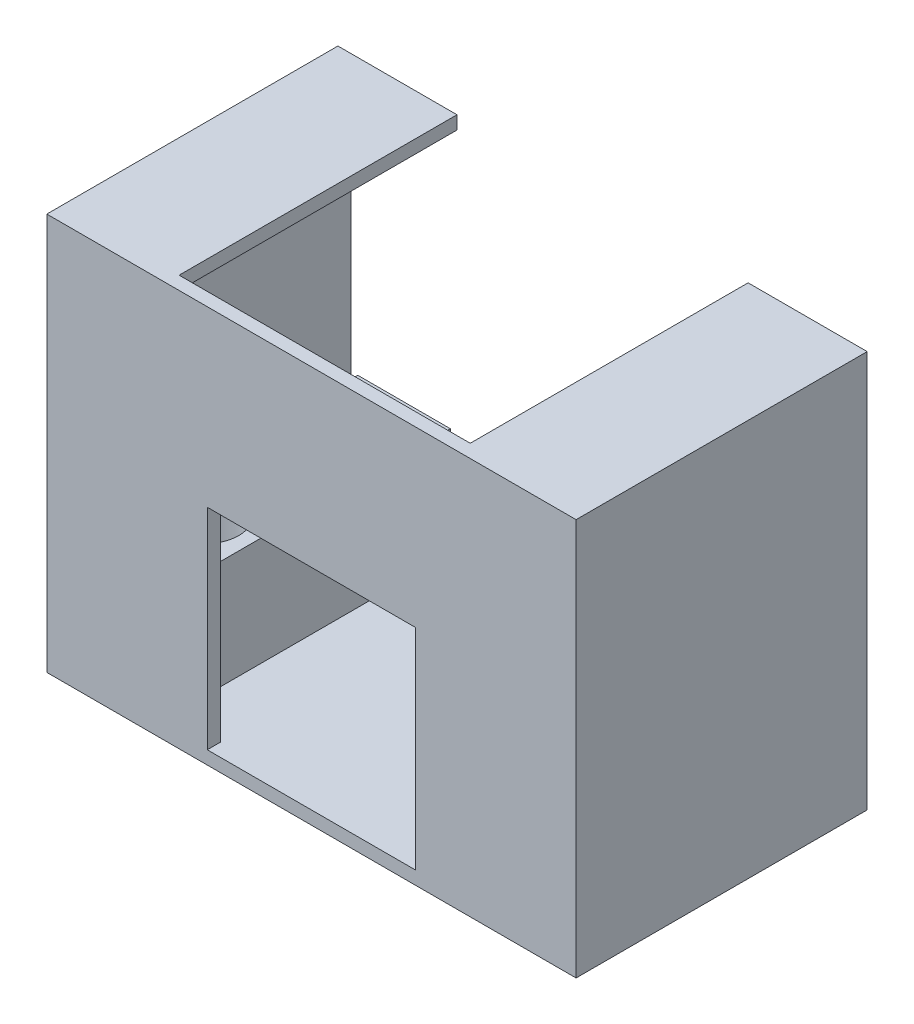
ISO-10303-21;
HEADER;
FILE_DESCRIPTION(('STEP AP214'),'2;1');
FILE_NAME('part.step','',(''),(''),'','','');
FILE_SCHEMA(('AUTOMOTIVE_DESIGN { 1 0 10303 214 1 1 1 1 }'));
ENDSEC;
DATA;
#1=APPLICATION_CONTEXT('core data for automotive mechanical design processes');
#2=APPLICATION_PROTOCOL_DEFINITION('international standard','automotive_design',2000,#1);
#3=PRODUCT_CONTEXT('',#1,'mechanical');
#4=PRODUCT('Part','Part','',(#3));
#5=PRODUCT_RELATED_PRODUCT_CATEGORY('part','',(#4));
#6=PRODUCT_DEFINITION_FORMATION('','',#4);
#7=PRODUCT_DEFINITION_CONTEXT('part definition',#1,'design');
#8=PRODUCT_DEFINITION('design','',#6,#7);
#9=PRODUCT_DEFINITION_SHAPE('','',#8);
#10=(LENGTH_UNIT() NAMED_UNIT(*) SI_UNIT(.MILLI.,.METRE.));
#11=(NAMED_UNIT(*) PLANE_ANGLE_UNIT() SI_UNIT($,.RADIAN.));
#12=(NAMED_UNIT(*) SI_UNIT($,.STERADIAN.) SOLID_ANGLE_UNIT());
#13=UNCERTAINTY_MEASURE_WITH_UNIT(LENGTH_MEASURE(1.E-05),#10,'distance_accuracy_value','');
#14=(GEOMETRIC_REPRESENTATION_CONTEXT(3) GLOBAL_UNCERTAINTY_ASSIGNED_CONTEXT((#13)) GLOBAL_UNIT_ASSIGNED_CONTEXT((#10,
#11,#12)) REPRESENTATION_CONTEXT('',''));
#15=CARTESIAN_POINT('',(0.,0.,0.));
#16=DIRECTION('',(0.,0.,1.));
#17=DIRECTION('',(1.,0.,0.));
#18=AXIS2_PLACEMENT_3D('',#15,#16,#17);
#19=CARTESIAN_POINT('',(0.,0.,-6.));
#20=DIRECTION('',(0.,0.,-1.));
#21=DIRECTION('',(-1.,0.,0.));
#22=AXIS2_PLACEMENT_3D('',#19,#20,#21);
#23=PLANE('',#22);
#24=DIRECTION('',(1.,0.,0.));
#25=VECTOR('',#24,1.);
#26=CARTESIAN_POINT('',(0.,19.7449997738004,-6.));
#27=LINE('',#26,#25);
#28=CARTESIAN_POINT('',(11.,19.7449997738004,-6.));
#29=VERTEX_POINT('',#28);
#30=CARTESIAN_POINT('',(19.,19.7449997738004,-6.));
#31=VERTEX_POINT('',#30);
#32=EDGE_CURVE('E215',#29,#31,#27,.T.);
#33=ORIENTED_EDGE('',*,*,#32,.F.);
#34=DIRECTION('',(0.,1.,0.));
#35=VECTOR('',#34,1.);
#36=CARTESIAN_POINT('',(11.,19.7449997738004,-6.));
#37=LINE('',#36,#35);
#38=CARTESIAN_POINT('',(11.,20.7449997738004,-6.));
#39=VERTEX_POINT('',#38);
#40=EDGE_CURVE('E198',#29,#39,#37,.T.);
#41=ORIENTED_EDGE('',*,*,#40,.T.);
#42=DIRECTION('',(1.,0.,0.));
#43=VECTOR('',#42,1.);
#44=CARTESIAN_POINT('',(0.,20.7449997738004,-6.));
#45=LINE('',#44,#43);
#46=CARTESIAN_POINT('',(20.,20.7449997738004,-6.));
#47=VERTEX_POINT('',#46);
#48=EDGE_CURVE('E243',#39,#47,#45,.T.);
#49=ORIENTED_EDGE('',*,*,#48,.T.);
#50=DIRECTION('',(0.,-1.,0.));
#51=VECTOR('',#50,1.);
#52=CARTESIAN_POINT('',(20.,0.,-6.));
#53=LINE('',#52,#51);
#54=CARTESIAN_POINT('',(20.,-9.25500022619963,-6.));
#55=VERTEX_POINT('',#54);
#56=EDGE_CURVE('E250',#47,#55,#53,.T.);
#57=ORIENTED_EDGE('',*,*,#56,.T.);
#58=DIRECTION('',(-1.,0.,0.));
#59=VECTOR('',#58,1.);
#60=CARTESIAN_POINT('',(0.,-9.25500022619963,-6.));
#61=LINE('',#60,#59);
#62=CARTESIAN_POINT('',(-20.,-9.25500022619963,-6.));
#63=VERTEX_POINT('',#62);
#64=EDGE_CURVE('E247',#55,#63,#61,.T.);
#65=ORIENTED_EDGE('',*,*,#64,.T.);
#66=DIRECTION('',(0.,1.,0.));
#67=VECTOR('',#66,1.);
#68=CARTESIAN_POINT('',(-20.,0.,-6.));
#69=LINE('',#68,#67);
#70=CARTESIAN_POINT('',(-20.,20.7449997738004,-6.));
#71=VERTEX_POINT('',#70);
#72=EDGE_CURVE('E244',#63,#71,#69,.T.);
#73=ORIENTED_EDGE('',*,*,#72,.T.);
#74=CARTESIAN_POINT('',(-11.,20.7449997738004,-6.));
#75=VERTEX_POINT('',#74);
#76=EDGE_CURVE('E240',#71,#75,#45,.T.);
#77=ORIENTED_EDGE('',*,*,#76,.T.);
#78=DIRECTION('',(0.,1.,0.));
#79=VECTOR('',#78,1.);
#80=CARTESIAN_POINT('',(-11.,19.7449997738004,-6.));
#81=LINE('',#80,#79);
#82=CARTESIAN_POINT('',(-11.,19.7449997738004,-6.));
#83=VERTEX_POINT('',#82);
#84=EDGE_CURVE('E208',#83,#75,#81,.T.);
#85=ORIENTED_EDGE('',*,*,#84,.F.);
#86=CARTESIAN_POINT('',(-19.,19.7449997738004,-6.));
#87=VERTEX_POINT('',#86);
#88=EDGE_CURVE('E224',#87,#83,#27,.T.);
#89=ORIENTED_EDGE('',*,*,#88,.F.);
#90=DIRECTION('',(0.,1.,0.));
#91=VECTOR('',#90,1.);
#92=CARTESIAN_POINT('',(-19.,0.,-6.));
#93=LINE('',#92,#91);
#94=CARTESIAN_POINT('',(-19.,-8.25500022619963,-6.));
#95=VERTEX_POINT('',#94);
#96=EDGE_CURVE('E225',#95,#87,#93,.T.);
#97=ORIENTED_EDGE('',*,*,#96,.F.);
#98=DIRECTION('',(-1.,0.,0.));
#99=VECTOR('',#98,1.);
#100=CARTESIAN_POINT('',(0.,-8.25500022619963,-6.));
#101=LINE('',#100,#99);
#102=CARTESIAN_POINT('',(-18.5000000000002,-8.25500022619963,-6.));
#103=VERTEX_POINT('',#102);
#104=EDGE_CURVE('E238',#103,#95,#101,.T.);
#105=ORIENTED_EDGE('',*,*,#104,.F.);
#106=DIRECTION('',(0.,1.,0.));
#107=VECTOR('',#106,1.);
#108=CARTESIAN_POINT('',(-18.5000000000002,0.,-6.));
#109=LINE('',#108,#107);
#110=CARTESIAN_POINT('',(-18.5000000000002,-0.0550002261996245,-6.));
#111=VERTEX_POINT('',#110);
#112=EDGE_CURVE('E435',#103,#111,#109,.T.);
#113=ORIENTED_EDGE('',*,*,#112,.T.);
#114=DIRECTION('',(1.,0.,0.));
#115=VECTOR('',#114,1.);
#116=CARTESIAN_POINT('',(0.,-0.0550002261996268,-6.));
#117=LINE('',#116,#115);
#118=CARTESIAN_POINT('',(-11.5000000000002,-0.0550002261996254,-6.));
#119=VERTEX_POINT('',#118);
#120=EDGE_CURVE('E438',#111,#119,#117,.T.);
#121=ORIENTED_EDGE('',*,*,#120,.T.);
#122=DIRECTION('',(0.,-1.,0.));
#123=VECTOR('',#122,1.);
#124=CARTESIAN_POINT('',(-11.5000000000002,0.,-6.));
#125=LINE('',#124,#123);
#126=CARTESIAN_POINT('',(-11.5000000000002,-8.25500022619963,-6.));
#127=VERTEX_POINT('',#126);
#128=EDGE_CURVE('E432',#119,#127,#125,.T.);
#129=ORIENTED_EDGE('',*,*,#128,.T.);
#130=CARTESIAN_POINT('',(11.4999999999998,-8.25500022619963,-6.));
#131=VERTEX_POINT('',#130);
#132=EDGE_CURVE('E237',#131,#127,#101,.T.);
#133=ORIENTED_EDGE('',*,*,#132,.F.);
#134=DIRECTION('',(0.,1.,0.));
#135=VECTOR('',#134,1.);
#136=CARTESIAN_POINT('',(11.4999999999998,0.,-6.));
#137=LINE('',#136,#135);
#138=CARTESIAN_POINT('',(11.4999999999998,-0.055000226199629,-6.));
#139=VERTEX_POINT('',#138);
#140=EDGE_CURVE('E414',#131,#139,#137,.T.);
#141=ORIENTED_EDGE('',*,*,#140,.T.);
#142=DIRECTION('',(1.,0.,0.));
#143=VECTOR('',#142,1.);
#144=CARTESIAN_POINT('',(0.,-0.0550002261996276,-6.));
#145=LINE('',#144,#143);
#146=CARTESIAN_POINT('',(18.4999999999998,-0.0550002261996299,-6.));
#147=VERTEX_POINT('',#146);
#148=EDGE_CURVE('E417',#139,#147,#145,.T.);
#149=ORIENTED_EDGE('',*,*,#148,.T.);
#150=DIRECTION('',(0.,-1.,0.));
#151=VECTOR('',#150,1.);
#152=CARTESIAN_POINT('',(18.4999999999998,0.,-6.));
#153=LINE('',#152,#151);
#154=CARTESIAN_POINT('',(18.4999999999998,-8.25500022619963,-6.));
#155=VERTEX_POINT('',#154);
#156=EDGE_CURVE('E411',#147,#155,#153,.T.);
#157=ORIENTED_EDGE('',*,*,#156,.T.);
#158=CARTESIAN_POINT('',(19.,-8.25500022619963,-6.));
#159=VERTEX_POINT('',#158);
#160=EDGE_CURVE('E230',#159,#155,#101,.T.);
#161=ORIENTED_EDGE('',*,*,#160,.F.);
#162=DIRECTION('',(0.,-1.,0.));
#163=VECTOR('',#162,1.);
#164=CARTESIAN_POINT('',(19.,0.,-6.));
#165=LINE('',#164,#163);
#166=EDGE_CURVE('E222',#31,#159,#165,.T.);
#167=ORIENTED_EDGE('',*,*,#166,.F.);
#168=EDGE_LOOP('',(#33,#41,#49,#57,#65,#73,#77,#85,#89,#97,#105,#113,#121,#129,#133,#141,#149,
#157,#161,#167));
#169=FACE_BOUND('',#168,.T.);
#170=ADVANCED_FACE('F36',(#169),#23,.T.);
#171=CARTESIAN_POINT('',(0.,20.7449997738004,16.));
#172=DIRECTION('',(0.,-1.,0.));
#173=DIRECTION('',(0.,0.,-1.));
#174=AXIS2_PLACEMENT_3D('',#171,#172,#173);
#175=PLANE('',#174);
#176=DIRECTION('',(0.,0.,1.));
#177=VECTOR('',#176,1.);
#178=CARTESIAN_POINT('',(11.,20.7449997738004,0.));
#179=LINE('',#178,#177);
#180=CARTESIAN_POINT('',(11.,20.7449997738004,15.));
#181=VERTEX_POINT('',#180);
#182=EDGE_CURVE('E204',#39,#181,#179,.T.);
#183=ORIENTED_EDGE('',*,*,#182,.T.);
#184=DIRECTION('',(1.,0.,0.));
#185=VECTOR('',#184,1.);
#186=CARTESIAN_POINT('',(0.,20.7449997738004,15.));
#187=LINE('',#186,#185);
#188=CARTESIAN_POINT('',(-11.,20.7449997738004,15.));
#189=VERTEX_POINT('',#188);
#190=EDGE_CURVE('E219',#189,#181,#187,.T.);
#191=ORIENTED_EDGE('',*,*,#190,.F.);
#192=DIRECTION('',(0.,0.,1.));
#193=VECTOR('',#192,1.);
#194=CARTESIAN_POINT('',(-11.,20.7449997738004,0.));
#195=LINE('',#194,#193);
#196=EDGE_CURVE('E884',#75,#189,#195,.T.);
#197=ORIENTED_EDGE('',*,*,#196,.F.);
#198=ORIENTED_EDGE('',*,*,#76,.F.);
#199=DIRECTION('',(0.,0.,-1.));
#200=VECTOR('',#199,1.);
#201=CARTESIAN_POINT('',(-20.,20.7449997738004,16.));
#202=LINE('',#201,#200);
#203=CARTESIAN_POINT('',(-20.,20.7449997738004,16.));
#204=VERTEX_POINT('',#203);
#205=EDGE_CURVE('E228',#204,#71,#202,.T.);
#206=ORIENTED_EDGE('',*,*,#205,.F.);
#207=DIRECTION('',(-1.,0.,0.));
#208=VECTOR('',#207,1.);
#209=CARTESIAN_POINT('',(0.,20.7449997738004,16.));
#210=LINE('',#209,#208);
#211=CARTESIAN_POINT('',(20.,20.7449997738004,16.));
#212=VERTEX_POINT('',#211);
#213=EDGE_CURVE('E285',#212,#204,#210,.T.);
#214=ORIENTED_EDGE('',*,*,#213,.F.);
#215=DIRECTION('',(0.,0.,-1.));
#216=VECTOR('',#215,1.);
#217=CARTESIAN_POINT('',(20.,20.7449997738004,16.));
#218=LINE('',#217,#216);
#219=EDGE_CURVE('E259',#212,#47,#218,.T.);
#220=ORIENTED_EDGE('',*,*,#219,.T.);
#221=ORIENTED_EDGE('',*,*,#48,.F.);
#222=EDGE_LOOP('',(#183,#191,#197,#198,#206,#214,#220,#221));
#223=FACE_BOUND('',#222,.T.);
#224=ADVANCED_FACE('F484',(#223),#175,.F.);
#225=CARTESIAN_POINT('',(0.,19.7449997738004,16.));
#226=DIRECTION('',(0.,-1.,0.));
#227=DIRECTION('',(0.,0.,-1.));
#228=AXIS2_PLACEMENT_3D('',#225,#226,#227);
#229=PLANE('',#228);
#230=DIRECTION('',(-1.,0.,0.));
#231=VECTOR('',#230,1.);
#232=CARTESIAN_POINT('',(0.,19.7449997738004,15.));
#233=LINE('',#232,#231);
#234=CARTESIAN_POINT('',(19.,19.7449997738004,15.));
#235=VERTEX_POINT('',#234);
#236=CARTESIAN_POINT('',(11.,19.7449997738004,15.));
#237=VERTEX_POINT('',#236);
#238=EDGE_CURVE('E218',#235,#237,#233,.T.);
#239=ORIENTED_EDGE('',*,*,#238,.T.);
#240=DIRECTION('',(0.,0.,1.));
#241=VECTOR('',#240,1.);
#242=CARTESIAN_POINT('',(11.,19.7449997738004,0.));
#243=LINE('',#242,#241);
#244=EDGE_CURVE('E201',#29,#237,#243,.T.);
#245=ORIENTED_EDGE('',*,*,#244,.F.);
#246=ORIENTED_EDGE('',*,*,#32,.T.);
#247=DIRECTION('',(0.,0.,-1.));
#248=VECTOR('',#247,1.);
#249=CARTESIAN_POINT('',(19.,19.7449997738004,16.));
#250=LINE('',#249,#248);
#251=EDGE_CURVE('E40',#235,#31,#250,.T.);
#252=ORIENTED_EDGE('',*,*,#251,.F.);
#253=EDGE_LOOP('',(#239,#245,#246,#252));
#254=FACE_BOUND('',#253,.T.);
#255=ADVANCED_FACE('F213',(#254),#229,.T.);
#256=CARTESIAN_POINT('',(15.,-0.055000226199628,9.));
#257=DIRECTION('',(0.,-1.,0.));
#258=DIRECTION('',(0.,0.,-1.));
#259=AXIS2_PLACEMENT_3D('',#256,#257,#258);
#260=CYLINDRICAL_SURFACE('',#259,2.5);
#261=CARTESIAN_POINT('',(15.,-0.055000226199628,9.));
#262=DIRECTION('',(0.,-1.,0.));
#263=DIRECTION('',(0.,0.,-1.));
#264=AXIS2_PLACEMENT_3D('',#261,#262,#263);
#265=CIRCLE('',#264,2.5);
#266=CARTESIAN_POINT('',(15.,-0.055000226199628,6.5));
#267=VERTEX_POINT('',#266);
#268=EDGE_CURVE('E400',#267,#267,#265,.T.);
#269=ORIENTED_EDGE('',*,*,#268,.F.);
#270=EDGE_LOOP('',(#269));
#271=FACE_BOUND('',#270,.T.);
#272=CARTESIAN_POINT('',(15.,-8.45500022619963,9.));
#273=DIRECTION('',(0.,-1.,0.));
#274=DIRECTION('',(0.,0.,-1.));
#275=AXIS2_PLACEMENT_3D('',#272,#273,#274);
#276=CIRCLE('',#275,2.5);
#277=CARTESIAN_POINT('',(15.,-8.45500022619963,6.5));
#278=VERTEX_POINT('',#277);
#279=EDGE_CURVE('E370',#278,#278,#276,.T.);
#280=ORIENTED_EDGE('',*,*,#279,.T.);
#281=EDGE_LOOP('',(#280));
#282=FACE_BOUND('',#281,.T.);
#283=ADVANCED_FACE('F717',(#271,#282),#260,.F.);
#284=CARTESIAN_POINT('',(15.0000000000001,-0.055000226199628,-0.999999999999999));
#285=DIRECTION('',(0.,-1.,0.));
#286=DIRECTION('',(0.,0.,-1.));
#287=AXIS2_PLACEMENT_3D('',#284,#285,#286);
#288=CYLINDRICAL_SURFACE('',#287,2.5);
#289=CARTESIAN_POINT('',(15.0000000000001,-0.055000226199628,-0.999999999999999));
#290=DIRECTION('',(0.,-1.,0.));
#291=DIRECTION('',(0.,0.,-1.));
#292=AXIS2_PLACEMENT_3D('',#289,#290,#291);
#293=CIRCLE('',#292,2.5);
#294=CARTESIAN_POINT('',(15.0000000000001,-0.055000226199628,-3.5));
#295=VERTEX_POINT('',#294);
#296=EDGE_CURVE('E404',#295,#295,#293,.T.);
#297=ORIENTED_EDGE('',*,*,#296,.F.);
#298=EDGE_LOOP('',(#297));
#299=FACE_BOUND('',#298,.T.);
#300=CARTESIAN_POINT('',(15.0000000000001,-8.45500022619963,-0.999999999999999));
#301=DIRECTION('',(0.,-1.,0.));
#302=DIRECTION('',(0.,0.,-1.));
#303=AXIS2_PLACEMENT_3D('',#300,#301,#302);
#304=CIRCLE('',#303,2.5);
#305=CARTESIAN_POINT('',(15.0000000000001,-8.45500022619963,-3.5));
#306=VERTEX_POINT('',#305);
#307=EDGE_CURVE('E357',#306,#306,#304,.T.);
#308=ORIENTED_EDGE('',*,*,#307,.T.);
#309=EDGE_LOOP('',(#308));
#310=FACE_BOUND('',#309,.T.);
#311=ADVANCED_FACE('F722',(#299,#310),#288,.F.);
#312=CARTESIAN_POINT('',(-15.,-0.055000226199628,9.));
#313=DIRECTION('',(0.,-1.,0.));
#314=DIRECTION('',(0.,0.,-1.));
#315=AXIS2_PLACEMENT_3D('',#312,#313,#314);
#316=CYLINDRICAL_SURFACE('',#315,2.5);
#317=CARTESIAN_POINT('',(-15.,-0.055000226199628,9.));
#318=DIRECTION('',(0.,-1.,0.));
#319=DIRECTION('',(0.,0.,-1.));
#320=AXIS2_PLACEMENT_3D('',#317,#318,#319);
#321=CIRCLE('',#320,2.5);
#322=CARTESIAN_POINT('',(-15.,-0.055000226199628,6.5));
#323=VERTEX_POINT('',#322);
#324=EDGE_CURVE('E403',#323,#323,#321,.T.);
#325=ORIENTED_EDGE('',*,*,#324,.F.);
#326=EDGE_LOOP('',(#325));
#327=FACE_BOUND('',#326,.T.);
#328=CARTESIAN_POINT('',(-15.,-8.45500022619963,9.));
#329=DIRECTION('',(0.,-1.,0.));
#330=DIRECTION('',(0.,0.,-1.));
#331=AXIS2_PLACEMENT_3D('',#328,#329,#330);
#332=CIRCLE('',#331,2.5);
#333=CARTESIAN_POINT('',(-15.,-8.45500022619963,6.5));
#334=VERTEX_POINT('',#333);
#335=EDGE_CURVE('E381',#334,#334,#332,.T.);
#336=ORIENTED_EDGE('',*,*,#335,.T.);
#337=EDGE_LOOP('',(#336));
#338=FACE_BOUND('',#337,.T.);
#339=ADVANCED_FACE('F511',(#327,#338),#316,.F.);
#340=CARTESIAN_POINT('',(-14.9999999999999,-0.055000226199628,-0.999999999999999));
#341=DIRECTION('',(0.,-1.,0.));
#342=DIRECTION('',(0.,0.,-1.));
#343=AXIS2_PLACEMENT_3D('',#340,#341,#342);
#344=CYLINDRICAL_SURFACE('',#343,2.5);
#345=CARTESIAN_POINT('',(-14.9999999999999,-0.055000226199628,-0.999999999999999));
#346=DIRECTION('',(0.,-1.,0.));
#347=DIRECTION('',(0.,0.,-1.));
#348=AXIS2_PLACEMENT_3D('',#345,#346,#347);
#349=CIRCLE('',#348,2.5);
#350=CARTESIAN_POINT('',(-14.9999999999999,-0.055000226199628,-3.5));
#351=VERTEX_POINT('',#350);
#352=EDGE_CURVE('E397',#351,#351,#349,.T.);
#353=ORIENTED_EDGE('',*,*,#352,.F.);
#354=EDGE_LOOP('',(#353));
#355=FACE_BOUND('',#354,.T.);
#356=CARTESIAN_POINT('',(-14.9999999999999,-8.45500022619963,-0.999999999999999));
#357=DIRECTION('',(0.,-1.,0.));
#358=DIRECTION('',(0.,0.,-1.));
#359=AXIS2_PLACEMENT_3D('',#356,#357,#358);
#360=CIRCLE('',#359,2.5);
#361=CARTESIAN_POINT('',(-14.9999999999999,-8.45500022619963,-3.5));
#362=VERTEX_POINT('',#361);
#363=EDGE_CURVE('E373',#362,#362,#360,.T.);
#364=ORIENTED_EDGE('',*,*,#363,.T.);
#365=EDGE_LOOP('',(#364));
#366=FACE_BOUND('',#365,.T.);
#367=ADVANCED_FACE('F506',(#355,#366),#344,.F.);
#368=CARTESIAN_POINT('',(0.,-8.25500022619963,16.));
#369=DIRECTION('',(0.,1.,0.));
#370=DIRECTION('',(0.,0.,1.));
#371=AXIS2_PLACEMENT_3D('',#368,#369,#370);
#372=PLANE('',#371);
#373=ORIENTED_EDGE('',*,*,#160,.T.);
#374=DIRECTION('',(0.,0.,1.));
#375=VECTOR('',#374,1.);
#376=CARTESIAN_POINT('',(18.4999999999998,-8.25500022619963,-6.));
#377=LINE('',#376,#375);
#378=CARTESIAN_POINT('',(18.4999999999998,-8.25500022619963,15.));
#379=VERTEX_POINT('',#378);
#380=EDGE_CURVE('E351',#155,#379,#377,.T.);
#381=ORIENTED_EDGE('',*,*,#380,.T.);
#382=DIRECTION('',(1.,0.,0.));
#383=VECTOR('',#382,1.);
#384=CARTESIAN_POINT('',(0.,-8.25500022619963,15.));
#385=LINE('',#384,#383);
#386=CARTESIAN_POINT('',(19.,-8.25500022619963,15.));
#387=VERTEX_POINT('',#386);
#388=EDGE_CURVE('E289',#379,#387,#385,.T.);
#389=ORIENTED_EDGE('',*,*,#388,.T.);
#390=DIRECTION('',(0.,0.,-1.));
#391=VECTOR('',#390,1.);
#392=CARTESIAN_POINT('',(19.,-8.25500022619963,16.));
#393=LINE('',#392,#391);
#394=EDGE_CURVE('E262',#387,#159,#393,.T.);
#395=ORIENTED_EDGE('',*,*,#394,.T.);
#396=EDGE_LOOP('',(#373,#381,#389,#395));
#397=FACE_BOUND('',#396,.T.);
#398=ADVANCED_FACE('F349',(#397),#372,.T.);
#399=CARTESIAN_POINT('',(7.87399988621473,-8.25500022619963,15.));
#400=VERTEX_POINT('',#399);
#401=CARTESIAN_POINT('',(11.4999999999998,-8.25500022619963,15.));
#402=VERTEX_POINT('',#401);
#403=EDGE_CURVE('E293',#400,#402,#385,.T.);
#404=ORIENTED_EDGE('',*,*,#403,.T.);
#405=DIRECTION('',(0.,0.,1.));
#406=VECTOR('',#405,1.);
#407=CARTESIAN_POINT('',(11.4999999999998,-8.25500022619963,-6.));
#408=LINE('',#407,#406);
#409=EDGE_CURVE('E428',#131,#402,#408,.T.);
#410=ORIENTED_EDGE('',*,*,#409,.F.);
#411=ORIENTED_EDGE('',*,*,#132,.T.);
#412=DIRECTION('',(0.,0.,1.));
#413=VECTOR('',#412,1.);
#414=CARTESIAN_POINT('',(-11.5000000000002,-8.25500022619963,-6.));
#415=LINE('',#414,#413);
#416=CARTESIAN_POINT('',(-11.5000000000002,-8.25500022619963,15.));
#417=VERTEX_POINT('',#416);
#418=EDGE_CURVE('E253',#127,#417,#415,.T.);
#419=ORIENTED_EDGE('',*,*,#418,.T.);
#420=CARTESIAN_POINT('',(-7.87399988621473,-8.25500022619963,15.));
#421=VERTEX_POINT('',#420);
#422=EDGE_CURVE('E292',#417,#421,#385,.T.);
#423=ORIENTED_EDGE('',*,*,#422,.T.);
#424=DIRECTION('',(0.,0.,1.));
#425=VECTOR('',#424,1.);
#426=CARTESIAN_POINT('',(-7.87399988621473,-8.25500022619963,15.));
#427=LINE('',#426,#425);
#428=CARTESIAN_POINT('',(-7.87399988621473,-8.25500022619963,16.));
#429=VERTEX_POINT('',#428);
#430=EDGE_CURVE('E306',#421,#429,#427,.T.);
#431=ORIENTED_EDGE('',*,*,#430,.T.);
#432=DIRECTION('',(1.,0.,0.));
#433=VECTOR('',#432,1.);
#434=CARTESIAN_POINT('',(0.,-8.25500022619963,16.));
#435=LINE('',#434,#433);
#436=CARTESIAN_POINT('',(7.87399988621473,-8.25500022619963,16.));
#437=VERTEX_POINT('',#436);
#438=EDGE_CURVE('E287',#429,#437,#435,.T.);
#439=ORIENTED_EDGE('',*,*,#438,.T.);
#440=DIRECTION('',(0.,0.,1.));
#441=VECTOR('',#440,1.);
#442=CARTESIAN_POINT('',(7.87399988621473,-8.25500022619963,15.));
#443=LINE('',#442,#441);
#444=EDGE_CURVE('E308',#400,#437,#443,.T.);
#445=ORIENTED_EDGE('',*,*,#444,.F.);
#446=EDGE_LOOP('',(#404,#410,#411,#419,#423,#431,#439,#445));
#447=FACE_BOUND('',#446,.T.);
#448=ADVANCED_FACE('F337',(#447),#372,.T.);
#449=CARTESIAN_POINT('',(0.,0.,15.));
#450=DIRECTION('',(0.,0.,1.));
#451=DIRECTION('',(1.,0.,0.));
#452=AXIS2_PLACEMENT_3D('',#449,#450,#451);
#453=PLANE('',#452);
#454=DIRECTION('',(0.,-1.,0.));
#455=VECTOR('',#454,1.);
#456=CARTESIAN_POINT('',(18.4999999999998,0.,15.));
#457=LINE('',#456,#455);
#458=CARTESIAN_POINT('',(18.4999999999998,-0.0550002261996299,15.));
#459=VERTEX_POINT('',#458);
#460=EDGE_CURVE('E61',#459,#379,#457,.T.);
#461=ORIENTED_EDGE('',*,*,#460,.F.);
#462=DIRECTION('',(1.,0.,0.));
#463=VECTOR('',#462,1.);
#464=CARTESIAN_POINT('',(0.,-0.0550002261996276,15.));
#465=LINE('',#464,#463);
#466=CARTESIAN_POINT('',(11.4999999999998,-0.055000226199629,15.));
#467=VERTEX_POINT('',#466);
#468=EDGE_CURVE('E415',#467,#459,#465,.T.);
#469=ORIENTED_EDGE('',*,*,#468,.F.);
#470=DIRECTION('',(0.,1.,0.));
#471=VECTOR('',#470,1.);
#472=CARTESIAN_POINT('',(11.4999999999998,0.,15.));
#473=LINE('',#472,#471);
#474=EDGE_CURVE('E346',#402,#467,#473,.T.);
#475=ORIENTED_EDGE('',*,*,#474,.F.);
#476=ORIENTED_EDGE('',*,*,#403,.F.);
#477=DIRECTION('',(0.,1.,0.));
#478=VECTOR('',#477,1.);
#479=CARTESIAN_POINT('',(7.87399988621473,-8.25500022619963,15.));
#480=LINE('',#479,#478);
#481=CARTESIAN_POINT('',(7.87399988621473,7.61999981477857,15.));
#482=VERTEX_POINT('',#481);
#483=EDGE_CURVE('E305',#400,#482,#480,.T.);
#484=ORIENTED_EDGE('',*,*,#483,.T.);
#485=DIRECTION('',(-1.,0.,0.));
#486=VECTOR('',#485,1.);
#487=CARTESIAN_POINT('',(7.87399988621473,7.61999981477857,15.));
#488=LINE('',#487,#486);
#489=CARTESIAN_POINT('',(-7.87399988621473,7.61999981477857,15.));
#490=VERTEX_POINT('',#489);
#491=EDGE_CURVE('E233',#482,#490,#488,.T.);
#492=ORIENTED_EDGE('',*,*,#491,.T.);
#493=DIRECTION('',(0.,-1.,0.));
#494=VECTOR('',#493,1.);
#495=CARTESIAN_POINT('',(-7.87399988621473,7.61999981477857,15.));
#496=LINE('',#495,#494);
#497=EDGE_CURVE('E318',#490,#421,#496,.T.);
#498=ORIENTED_EDGE('',*,*,#497,.T.);
#499=ORIENTED_EDGE('',*,*,#422,.F.);
#500=DIRECTION('',(0.,-1.,0.));
#501=VECTOR('',#500,1.);
#502=CARTESIAN_POINT('',(-11.5000000000002,0.,15.));
#503=LINE('',#502,#501);
#504=CARTESIAN_POINT('',(-11.5000000000002,-0.0550002261996254,15.));
#505=VERTEX_POINT('',#504);
#506=EDGE_CURVE('E431',#505,#417,#503,.T.);
#507=ORIENTED_EDGE('',*,*,#506,.F.);
#508=DIRECTION('',(1.,0.,0.));
#509=VECTOR('',#508,1.);
#510=CARTESIAN_POINT('',(0.,-0.0550002261996268,15.));
#511=LINE('',#510,#509);
#512=CARTESIAN_POINT('',(-18.5000000000002,-0.0550002261996245,15.));
#513=VERTEX_POINT('',#512);
#514=EDGE_CURVE('E436',#513,#505,#511,.T.);
#515=ORIENTED_EDGE('',*,*,#514,.F.);
#516=DIRECTION('',(0.,1.,0.));
#517=VECTOR('',#516,1.);
#518=CARTESIAN_POINT('',(-18.5000000000002,0.,15.));
#519=LINE('',#518,#517);
#520=CARTESIAN_POINT('',(-18.5000000000002,-8.25500022619963,15.));
#521=VERTEX_POINT('',#520);
#522=EDGE_CURVE('E443',#521,#513,#519,.T.);
#523=ORIENTED_EDGE('',*,*,#522,.F.);
#524=CARTESIAN_POINT('',(-19.,-8.25500022619963,15.));
#525=VERTEX_POINT('',#524);
#526=EDGE_CURVE('E294',#525,#521,#385,.T.);
#527=ORIENTED_EDGE('',*,*,#526,.F.);
#528=DIRECTION('',(0.,-1.,0.));
#529=VECTOR('',#528,1.);
#530=CARTESIAN_POINT('',(-19.,0.,15.));
#531=LINE('',#530,#529);
#532=CARTESIAN_POINT('',(-19.,19.7449997738004,15.));
#533=VERTEX_POINT('',#532);
#534=EDGE_CURVE('E297',#533,#525,#531,.T.);
#535=ORIENTED_EDGE('',*,*,#534,.F.);
#536=CARTESIAN_POINT('',(-11.,19.7449997738004,15.));
#537=VERTEX_POINT('',#536);
#538=EDGE_CURVE('E299',#537,#533,#233,.T.);
#539=ORIENTED_EDGE('',*,*,#538,.F.);
#540=DIRECTION('',(0.,1.,0.));
#541=VECTOR('',#540,1.);
#542=CARTESIAN_POINT('',(-11.,19.7449997738004,15.));
#543=LINE('',#542,#541);
#544=EDGE_CURVE('E53',#537,#189,#543,.T.);
#545=ORIENTED_EDGE('',*,*,#544,.T.);
#546=ORIENTED_EDGE('',*,*,#190,.T.);
#547=DIRECTION('',(0.,1.,0.));
#548=VECTOR('',#547,1.);
#549=CARTESIAN_POINT('',(11.,19.7449997738004,15.));
#550=LINE('',#549,#548);
#551=EDGE_CURVE('E355',#237,#181,#550,.T.);
#552=ORIENTED_EDGE('',*,*,#551,.F.);
#553=ORIENTED_EDGE('',*,*,#238,.F.);
#554=DIRECTION('',(0.,1.,0.));
#555=VECTOR('',#554,1.);
#556=CARTESIAN_POINT('',(19.,0.,15.));
#557=LINE('',#556,#555);
#558=EDGE_CURVE('E290',#387,#235,#557,.T.);
#559=ORIENTED_EDGE('',*,*,#558,.F.);
#560=ORIENTED_EDGE('',*,*,#388,.F.);
#561=EDGE_LOOP('',(#461,#469,#475,#476,#484,#492,#498,#499,#507,#515,#523,#527,#535,#539,#545,
#546,#552,#553,#559,#560));
#562=FACE_BOUND('',#561,.T.);
#563=ADVANCED_FACE('F324',(#562),#453,.F.);
#564=ORIENTED_EDGE('',*,*,#526,.T.);
#565=DIRECTION('',(0.,0.,1.));
#566=VECTOR('',#565,1.);
#567=CARTESIAN_POINT('',(-18.5000000000002,-8.25500022619963,-6.));
#568=LINE('',#567,#566);
#569=EDGE_CURVE('E452',#103,#521,#568,.T.);
#570=ORIENTED_EDGE('',*,*,#569,.F.);
#571=ORIENTED_EDGE('',*,*,#104,.T.);
#572=DIRECTION('',(0.,0.,-1.));
#573=VECTOR('',#572,1.);
#574=CARTESIAN_POINT('',(-19.,-8.25500022619963,16.));
#575=LINE('',#574,#573);
#576=EDGE_CURVE('E265',#525,#95,#575,.T.);
#577=ORIENTED_EDGE('',*,*,#576,.F.);
#578=EDGE_LOOP('',(#564,#570,#571,#577));
#579=FACE_BOUND('',#578,.T.);
#580=ADVANCED_FACE('F471',(#579),#372,.T.);
#581=CARTESIAN_POINT('',(7.87399988621473,7.61999981477857,15.));
#582=DIRECTION('',(0.,1.,0.));
#583=DIRECTION('',(0.,0.,1.));
#584=AXIS2_PLACEMENT_3D('',#581,#582,#583);
#585=PLANE('',#584);
#586=DIRECTION('',(-1.,0.,0.));
#587=VECTOR('',#586,1.);
#588=CARTESIAN_POINT('',(7.87399988621473,7.61999981477857,16.));
#589=LINE('',#588,#587);
#590=CARTESIAN_POINT('',(7.87399988621473,7.61999981477857,16.));
#591=VERTEX_POINT('',#590);
#592=CARTESIAN_POINT('',(-7.87399988621473,7.61999981477857,16.));
#593=VERTEX_POINT('',#592);
#594=EDGE_CURVE('E11',#591,#593,#589,.T.);
#595=ORIENTED_EDGE('',*,*,#594,.T.);
#596=DIRECTION('',(0.,0.,1.));
#597=VECTOR('',#596,1.);
#598=CARTESIAN_POINT('',(-7.87399988621473,7.61999981477857,15.));
#599=LINE('',#598,#597);
#600=EDGE_CURVE('E302',#490,#593,#599,.T.);
#601=ORIENTED_EDGE('',*,*,#600,.F.);
#602=ORIENTED_EDGE('',*,*,#491,.F.);
#603=DIRECTION('',(0.,0.,1.));
#604=VECTOR('',#603,1.);
#605=CARTESIAN_POINT('',(7.87399988621473,7.61999981477857,15.));
#606=LINE('',#605,#604);
#607=EDGE_CURVE('E301',#482,#591,#606,.T.);
#608=ORIENTED_EDGE('',*,*,#607,.T.);
#609=EDGE_LOOP('',(#595,#601,#602,#608));
#610=FACE_BOUND('',#609,.T.);
#611=ADVANCED_FACE('F328',(#610),#585,.F.);
#612=CARTESIAN_POINT('',(7.87399988621473,-8.25500022619963,15.));
#613=DIRECTION('',(1.,0.,0.));
#614=DIRECTION('',(0.,0.,-1.));
#615=AXIS2_PLACEMENT_3D('',#612,#613,#614);
#616=PLANE('',#615);
#617=DIRECTION('',(0.,1.,0.));
#618=VECTOR('',#617,1.);
#619=CARTESIAN_POINT('',(7.87399988621473,-8.25500022619963,16.));
#620=LINE('',#619,#618);
#621=EDGE_CURVE('E312',#437,#591,#620,.T.);
#622=ORIENTED_EDGE('',*,*,#621,.T.);
#623=ORIENTED_EDGE('',*,*,#607,.F.);
#624=ORIENTED_EDGE('',*,*,#483,.F.);
#625=ORIENTED_EDGE('',*,*,#444,.T.);
#626=EDGE_LOOP('',(#622,#623,#624,#625));
#627=FACE_BOUND('',#626,.T.);
#628=ADVANCED_FACE('F342',(#627),#616,.F.);
#629=CARTESIAN_POINT('',(-20.,0.,16.));
#630=DIRECTION('',(1.,0.,0.));
#631=DIRECTION('',(0.,0.,-1.));
#632=AXIS2_PLACEMENT_3D('',#629,#630,#631);
#633=PLANE('',#632);
#634=ORIENTED_EDGE('',*,*,#72,.F.);
#635=DIRECTION('',(0.,0.,-1.));
#636=VECTOR('',#635,1.);
#637=CARTESIAN_POINT('',(-20.,-9.25500022619963,16.));
#638=LINE('',#637,#636);
#639=CARTESIAN_POINT('',(-20.,-9.25500022619963,16.));
#640=VERTEX_POINT('',#639);
#641=EDGE_CURVE('E255',#640,#63,#638,.T.);
#642=ORIENTED_EDGE('',*,*,#641,.F.);
#643=DIRECTION('',(0.,-1.,0.));
#644=VECTOR('',#643,1.);
#645=CARTESIAN_POINT('',(-20.,0.,16.));
#646=LINE('',#645,#644);
#647=EDGE_CURVE('E279',#204,#640,#646,.T.);
#648=ORIENTED_EDGE('',*,*,#647,.F.);
#649=ORIENTED_EDGE('',*,*,#205,.T.);
#650=EDGE_LOOP('',(#634,#642,#648,#649));
#651=FACE_BOUND('',#650,.T.);
#652=ADVANCED_FACE('F494',(#651),#633,.F.);
#653=CARTESIAN_POINT('',(0.,-9.25500022619963,16.));
#654=DIRECTION('',(0.,1.,0.));
#655=DIRECTION('',(0.,0.,1.));
#656=AXIS2_PLACEMENT_3D('',#653,#654,#655);
#657=PLANE('',#656);
#658=CARTESIAN_POINT('',(-14.9999999999999,-9.25500022619963,-0.999999999999999));
#659=DIRECTION('',(0.,-1.,0.));
#660=DIRECTION('',(0.,0.,-1.));
#661=AXIS2_PLACEMENT_3D('',#658,#659,#660);
#662=CIRCLE('',#661,4.);
#663=CARTESIAN_POINT('',(-14.9999999999999,-9.25500022619963,-5.));
#664=VERTEX_POINT('',#663);
#665=EDGE_CURVE('E376',#664,#664,#662,.T.);
#666=ORIENTED_EDGE('',*,*,#665,.F.);
#667=EDGE_LOOP('',(#666));
#668=FACE_BOUND('',#667,.T.);
#669=CARTESIAN_POINT('',(15.,-9.25500022619963,9.));
#670=DIRECTION('',(0.,-1.,0.));
#671=DIRECTION('',(0.,0.,-1.));
#672=AXIS2_PLACEMENT_3D('',#669,#670,#671);
#673=CIRCLE('',#672,4.);
#674=CARTESIAN_POINT('',(15.,-9.25500022619963,5.));
#675=VERTEX_POINT('',#674);
#676=EDGE_CURVE('E386',#675,#675,#673,.T.);
#677=ORIENTED_EDGE('',*,*,#676,.F.);
#678=EDGE_LOOP('',(#677));
#679=FACE_BOUND('',#678,.T.);
#680=CARTESIAN_POINT('',(15.0000000000001,-9.25500022619963,-0.999999999999999));
#681=DIRECTION('',(0.,-1.,0.));
#682=DIRECTION('',(0.,0.,-1.));
#683=AXIS2_PLACEMENT_3D('',#680,#681,#682);
#684=CIRCLE('',#683,4.);
#685=CARTESIAN_POINT('',(15.0000000000001,-9.25500022619963,-5.));
#686=VERTEX_POINT('',#685);
#687=EDGE_CURVE('E360',#686,#686,#684,.T.);
#688=ORIENTED_EDGE('',*,*,#687,.F.);
#689=EDGE_LOOP('',(#688));
#690=FACE_BOUND('',#689,.T.);
#691=CARTESIAN_POINT('',(-15.,-9.25500022619963,9.));
#692=DIRECTION('',(0.,-1.,0.));
#693=DIRECTION('',(0.,0.,-1.));
#694=AXIS2_PLACEMENT_3D('',#691,#692,#693);
#695=CIRCLE('',#694,4.);
#696=CARTESIAN_POINT('',(-15.,-9.25500022619963,5.));
#697=VERTEX_POINT('',#696);
#698=EDGE_CURVE('E393',#697,#697,#695,.T.);
#699=ORIENTED_EDGE('',*,*,#698,.F.);
#700=EDGE_LOOP('',(#699));
#701=FACE_BOUND('',#700,.T.);
#702=ORIENTED_EDGE('',*,*,#64,.F.);
#703=DIRECTION('',(0.,0.,-1.));
#704=VECTOR('',#703,1.);
#705=CARTESIAN_POINT('',(20.,-9.25500022619963,16.));
#706=LINE('',#705,#704);
#707=CARTESIAN_POINT('',(20.,-9.25500022619963,16.));
#708=VERTEX_POINT('',#707);
#709=EDGE_CURVE('E257',#708,#55,#706,.T.);
#710=ORIENTED_EDGE('',*,*,#709,.F.);
#711=DIRECTION('',(1.,0.,0.));
#712=VECTOR('',#711,1.);
#713=CARTESIAN_POINT('',(0.,-9.25500022619963,16.));
#714=LINE('',#713,#712);
#715=EDGE_CURVE('E273',#640,#708,#714,.T.);
#716=ORIENTED_EDGE('',*,*,#715,.F.);
#717=ORIENTED_EDGE('',*,*,#641,.T.);
#718=EDGE_LOOP('',(#702,#710,#716,#717));
#719=FACE_BOUND('',#718,.T.);
#720=ADVANCED_FACE('F497',(#668,#679,#690,#701,#719),#657,.F.);
#721=CARTESIAN_POINT('',(0.,0.,16.));
#722=DIRECTION('',(0.,0.,1.));
#723=DIRECTION('',(1.,0.,0.));
#724=AXIS2_PLACEMENT_3D('',#721,#722,#723);
#725=PLANE('',#724);
#726=ORIENTED_EDGE('',*,*,#438,.F.);
#727=DIRECTION('',(0.,-1.,0.));
#728=VECTOR('',#727,1.);
#729=CARTESIAN_POINT('',(-7.87399988621473,7.61999981477857,16.));
#730=LINE('',#729,#728);
#731=EDGE_CURVE('E45',#593,#429,#730,.T.);
#732=ORIENTED_EDGE('',*,*,#731,.F.);
#733=ORIENTED_EDGE('',*,*,#594,.F.);
#734=ORIENTED_EDGE('',*,*,#621,.F.);
#735=EDGE_LOOP('',(#726,#732,#733,#734));
#736=FACE_BOUND('',#735,.T.);
#737=ORIENTED_EDGE('',*,*,#213,.T.);
#738=ORIENTED_EDGE('',*,*,#647,.T.);
#739=ORIENTED_EDGE('',*,*,#715,.T.);
#740=DIRECTION('',(0.,1.,0.));
#741=VECTOR('',#740,1.);
#742=CARTESIAN_POINT('',(20.,0.,16.));
#743=LINE('',#742,#741);
#744=EDGE_CURVE('E271',#708,#212,#743,.T.);
#745=ORIENTED_EDGE('',*,*,#744,.T.);
#746=EDGE_LOOP('',(#737,#738,#739,#745));
#747=FACE_BOUND('',#746,.T.);
#748=ADVANCED_FACE('F340',(#736,#747),#725,.T.);
#749=CARTESIAN_POINT('',(20.,0.,16.));
#750=DIRECTION('',(-1.,0.,0.));
#751=DIRECTION('',(0.,0.,1.));
#752=AXIS2_PLACEMENT_3D('',#749,#750,#751);
#753=PLANE('',#752);
#754=ORIENTED_EDGE('',*,*,#56,.F.);
#755=ORIENTED_EDGE('',*,*,#219,.F.);
#756=ORIENTED_EDGE('',*,*,#744,.F.);
#757=ORIENTED_EDGE('',*,*,#709,.T.);
#758=EDGE_LOOP('',(#754,#755,#756,#757));
#759=FACE_BOUND('',#758,.T.);
#760=ADVANCED_FACE('F502',(#759),#753,.F.);
#761=CARTESIAN_POINT('',(-7.87399988621473,7.61999981477857,15.));
#762=DIRECTION('',(-1.,0.,0.));
#763=DIRECTION('',(0.,0.,1.));
#764=AXIS2_PLACEMENT_3D('',#761,#762,#763);
#765=PLANE('',#764);
#766=ORIENTED_EDGE('',*,*,#731,.T.);
#767=ORIENTED_EDGE('',*,*,#430,.F.);
#768=ORIENTED_EDGE('',*,*,#497,.F.);
#769=ORIENTED_EDGE('',*,*,#600,.T.);
#770=EDGE_LOOP('',(#766,#767,#768,#769));
#771=FACE_BOUND('',#770,.T.);
#772=ADVANCED_FACE('F333',(#771),#765,.F.);
#773=CARTESIAN_POINT('',(19.,0.,16.));
#774=DIRECTION('',(-1.,0.,0.));
#775=DIRECTION('',(0.,0.,1.));
#776=AXIS2_PLACEMENT_3D('',#773,#774,#775);
#777=PLANE('',#776);
#778=ORIENTED_EDGE('',*,*,#251,.T.);
#779=ORIENTED_EDGE('',*,*,#166,.T.);
#780=ORIENTED_EDGE('',*,*,#394,.F.);
#781=ORIENTED_EDGE('',*,*,#558,.T.);
#782=EDGE_LOOP('',(#778,#779,#780,#781));
#783=FACE_BOUND('',#782,.T.);
#784=ADVANCED_FACE('F353',(#783),#777,.T.);
#785=CARTESIAN_POINT('',(-19.,0.,16.));
#786=DIRECTION('',(1.,0.,0.));
#787=DIRECTION('',(0.,0.,-1.));
#788=AXIS2_PLACEMENT_3D('',#785,#786,#787);
#789=PLANE('',#788);
#790=ORIENTED_EDGE('',*,*,#576,.T.);
#791=ORIENTED_EDGE('',*,*,#96,.T.);
#792=DIRECTION('',(0.,0.,-1.));
#793=VECTOR('',#792,1.);
#794=CARTESIAN_POINT('',(-19.,19.7449997738004,16.));
#795=LINE('',#794,#793);
#796=EDGE_CURVE('E267',#533,#87,#795,.T.);
#797=ORIENTED_EDGE('',*,*,#796,.F.);
#798=ORIENTED_EDGE('',*,*,#534,.T.);
#799=EDGE_LOOP('',(#790,#791,#797,#798));
#800=FACE_BOUND('',#799,.T.);
#801=ADVANCED_FACE('F475',(#800),#789,.T.);
#802=DIRECTION('',(0.,0.,1.));
#803=VECTOR('',#802,1.);
#804=CARTESIAN_POINT('',(-11.,19.7449997738004,0.));
#805=LINE('',#804,#803);
#806=EDGE_CURVE('E209',#83,#537,#805,.T.);
#807=ORIENTED_EDGE('',*,*,#806,.T.);
#808=ORIENTED_EDGE('',*,*,#538,.T.);
#809=ORIENTED_EDGE('',*,*,#796,.T.);
#810=ORIENTED_EDGE('',*,*,#88,.T.);
#811=EDGE_LOOP('',(#807,#808,#809,#810));
#812=FACE_BOUND('',#811,.T.);
#813=ADVANCED_FACE('F38',(#812),#229,.T.);
#814=CARTESIAN_POINT('',(-11.5000000000002,0.,-6.));
#815=DIRECTION('',(-1.,0.,0.));
#816=DIRECTION('',(0.,0.,1.));
#817=AXIS2_PLACEMENT_3D('',#814,#815,#816);
#818=PLANE('',#817);
#819=ORIENTED_EDGE('',*,*,#506,.T.);
#820=ORIENTED_EDGE('',*,*,#418,.F.);
#821=ORIENTED_EDGE('',*,*,#128,.F.);
#822=DIRECTION('',(0.,0.,1.));
#823=VECTOR('',#822,1.);
#824=CARTESIAN_POINT('',(-11.5000000000002,-0.0550002261996254,-6.));
#825=LINE('',#824,#823);
#826=EDGE_CURVE('E440',#119,#505,#825,.T.);
#827=ORIENTED_EDGE('',*,*,#826,.T.);
#828=EDGE_LOOP('',(#819,#820,#821,#827));
#829=FACE_BOUND('',#828,.T.);
#830=ADVANCED_FACE('F459',(#829),#818,.F.);
#831=CARTESIAN_POINT('',(-18.5000000000002,0.,-6.));
#832=DIRECTION('',(1.,0.,0.));
#833=DIRECTION('',(0.,1.,0.));
#834=AXIS2_PLACEMENT_3D('',#831,#832,#833);
#835=PLANE('',#834);
#836=ORIENTED_EDGE('',*,*,#522,.T.);
#837=DIRECTION('',(0.,0.,1.));
#838=VECTOR('',#837,1.);
#839=CARTESIAN_POINT('',(-18.5000000000002,-0.0550002261996245,-6.));
#840=LINE('',#839,#838);
#841=EDGE_CURVE('E450',#111,#513,#840,.T.);
#842=ORIENTED_EDGE('',*,*,#841,.F.);
#843=ORIENTED_EDGE('',*,*,#112,.F.);
#844=ORIENTED_EDGE('',*,*,#569,.T.);
#845=EDGE_LOOP('',(#836,#842,#843,#844));
#846=FACE_BOUND('',#845,.T.);
#847=ADVANCED_FACE('F466',(#846),#835,.F.);
#848=CARTESIAN_POINT('',(0.,-0.0550002261996268,-6.));
#849=DIRECTION('',(0.,-1.,0.));
#850=DIRECTION('',(1.,0.,0.));
#851=AXIS2_PLACEMENT_3D('',#848,#849,#850);
#852=PLANE('',#851);
#853=ORIENTED_EDGE('',*,*,#352,.T.);
#854=EDGE_LOOP('',(#853));
#855=FACE_BOUND('',#854,.T.);
#856=ORIENTED_EDGE('',*,*,#324,.T.);
#857=EDGE_LOOP('',(#856));
#858=FACE_BOUND('',#857,.T.);
#859=ORIENTED_EDGE('',*,*,#514,.T.);
#860=ORIENTED_EDGE('',*,*,#826,.F.);
#861=ORIENTED_EDGE('',*,*,#120,.F.);
#862=ORIENTED_EDGE('',*,*,#841,.T.);
#863=EDGE_LOOP('',(#859,#860,#861,#862));
#864=FACE_BOUND('',#863,.T.);
#865=ADVANCED_FACE('F463',(#855,#858,#864),#852,.F.);
#866=CARTESIAN_POINT('',(18.4999999999998,0.,-6.));
#867=DIRECTION('',(-1.,0.,0.));
#868=DIRECTION('',(0.,-1.,0.));
#869=AXIS2_PLACEMENT_3D('',#866,#867,#868);
#870=PLANE('',#869);
#871=ORIENTED_EDGE('',*,*,#460,.T.);
#872=ORIENTED_EDGE('',*,*,#380,.F.);
#873=ORIENTED_EDGE('',*,*,#156,.F.);
#874=DIRECTION('',(0.,0.,1.));
#875=VECTOR('',#874,1.);
#876=CARTESIAN_POINT('',(18.4999999999998,-0.0550002261996299,-6.));
#877=LINE('',#876,#875);
#878=EDGE_CURVE('E419',#147,#459,#877,.T.);
#879=ORIENTED_EDGE('',*,*,#878,.T.);
#880=EDGE_LOOP('',(#871,#872,#873,#879));
#881=FACE_BOUND('',#880,.T.);
#882=ADVANCED_FACE('F577',(#881),#870,.F.);
#883=CARTESIAN_POINT('',(11.4999999999998,0.,-6.));
#884=DIRECTION('',(1.,0.,0.));
#885=DIRECTION('',(0.,1.,0.));
#886=AXIS2_PLACEMENT_3D('',#883,#884,#885);
#887=PLANE('',#886);
#888=ORIENTED_EDGE('',*,*,#474,.T.);
#889=DIRECTION('',(0.,0.,1.));
#890=VECTOR('',#889,1.);
#891=CARTESIAN_POINT('',(11.4999999999998,-0.055000226199629,-6.));
#892=LINE('',#891,#890);
#893=EDGE_CURVE('E425',#139,#467,#892,.T.);
#894=ORIENTED_EDGE('',*,*,#893,.F.);
#895=ORIENTED_EDGE('',*,*,#140,.F.);
#896=ORIENTED_EDGE('',*,*,#409,.T.);
#897=EDGE_LOOP('',(#888,#894,#895,#896));
#898=FACE_BOUND('',#897,.T.);
#899=ADVANCED_FACE('F587',(#898),#887,.F.);
#900=CARTESIAN_POINT('',(0.,-0.0550002261996276,-6.));
#901=DIRECTION('',(0.,-1.,0.));
#902=DIRECTION('',(1.,0.,0.));
#903=AXIS2_PLACEMENT_3D('',#900,#901,#902);
#904=PLANE('',#903);
#905=ORIENTED_EDGE('',*,*,#296,.T.);
#906=EDGE_LOOP('',(#905));
#907=FACE_BOUND('',#906,.T.);
#908=ORIENTED_EDGE('',*,*,#268,.T.);
#909=EDGE_LOOP('',(#908));
#910=FACE_BOUND('',#909,.T.);
#911=ORIENTED_EDGE('',*,*,#468,.T.);
#912=ORIENTED_EDGE('',*,*,#878,.F.);
#913=ORIENTED_EDGE('',*,*,#148,.F.);
#914=ORIENTED_EDGE('',*,*,#893,.T.);
#915=EDGE_LOOP('',(#911,#912,#913,#914));
#916=FACE_BOUND('',#915,.T.);
#917=ADVANCED_FACE('F597',(#907,#910,#916),#904,.F.);
#918=CARTESIAN_POINT('',(-14.9999999999999,-8.45500022619963,-0.999999999999999));
#919=DIRECTION('',(0.,-1.,0.));
#920=DIRECTION('',(0.,0.,-1.));
#921=AXIS2_PLACEMENT_3D('',#918,#919,#920);
#922=CYLINDRICAL_SURFACE('',#921,4.);
#923=CARTESIAN_POINT('',(-14.9999999999999,-8.45500022619963,-0.999999999999999));
#924=DIRECTION('',(0.,-1.,0.));
#925=DIRECTION('',(0.,0.,-1.));
#926=AXIS2_PLACEMENT_3D('',#923,#924,#925);
#927=CIRCLE('',#926,4.);
#928=CARTESIAN_POINT('',(-14.9999999999999,-8.45500022619963,-5.));
#929=VERTEX_POINT('',#928);
#930=EDGE_CURVE('E378',#929,#929,#927,.T.);
#931=ORIENTED_EDGE('',*,*,#930,.F.);
#932=EDGE_LOOP('',(#931));
#933=FACE_BOUND('',#932,.T.);
#934=ORIENTED_EDGE('',*,*,#665,.T.);
#935=EDGE_LOOP('',(#934));
#936=FACE_BOUND('',#935,.T.);
#937=ADVANCED_FACE('F607',(#933,#936),#922,.F.);
#938=CARTESIAN_POINT('',(-14.9999999999999,-8.45500022619963,-0.999999999999999));
#939=DIRECTION('',(0.,-1.,0.));
#940=DIRECTION('',(0.,0.,-1.));
#941=AXIS2_PLACEMENT_3D('',#938,#939,#940);
#942=PLANE('',#941);
#943=ORIENTED_EDGE('',*,*,#363,.F.);
#944=EDGE_LOOP('',(#943));
#945=FACE_BOUND('',#944,.T.);
#946=ORIENTED_EDGE('',*,*,#930,.T.);
#947=EDGE_LOOP('',(#946));
#948=FACE_BOUND('',#947,.T.);
#949=ADVANCED_FACE('F618',(#945,#948),#942,.T.);
#950=CARTESIAN_POINT('',(-15.,-8.45500022619963,9.));
#951=DIRECTION('',(0.,-1.,0.));
#952=DIRECTION('',(0.,0.,-1.));
#953=AXIS2_PLACEMENT_3D('',#950,#951,#952);
#954=CYLINDRICAL_SURFACE('',#953,4.);
#955=CARTESIAN_POINT('',(-15.,-8.45500022619963,9.));
#956=DIRECTION('',(0.,-1.,0.));
#957=DIRECTION('',(0.,0.,-1.));
#958=AXIS2_PLACEMENT_3D('',#955,#956,#957);
#959=CIRCLE('',#958,4.);
#960=CARTESIAN_POINT('',(-15.,-8.45500022619963,5.));
#961=VERTEX_POINT('',#960);
#962=EDGE_CURVE('E394',#961,#961,#959,.T.);
#963=ORIENTED_EDGE('',*,*,#962,.F.);
#964=EDGE_LOOP('',(#963));
#965=FACE_BOUND('',#964,.T.);
#966=ORIENTED_EDGE('',*,*,#698,.T.);
#967=EDGE_LOOP('',(#966));
#968=FACE_BOUND('',#967,.T.);
#969=ADVANCED_FACE('F628',(#965,#968),#954,.F.);
#970=CARTESIAN_POINT('',(-15.,-8.45500022619963,9.));
#971=DIRECTION('',(0.,-1.,0.));
#972=DIRECTION('',(0.,0.,-1.));
#973=AXIS2_PLACEMENT_3D('',#970,#971,#972);
#974=PLANE('',#973);
#975=ORIENTED_EDGE('',*,*,#335,.F.);
#976=EDGE_LOOP('',(#975));
#977=FACE_BOUND('',#976,.T.);
#978=ORIENTED_EDGE('',*,*,#962,.T.);
#979=EDGE_LOOP('',(#978));
#980=FACE_BOUND('',#979,.T.);
#981=ADVANCED_FACE('F638',(#977,#980),#974,.T.);
#982=CARTESIAN_POINT('',(15.0000000000001,-8.45500022619963,-0.999999999999999));
#983=DIRECTION('',(0.,-1.,0.));
#984=DIRECTION('',(0.,0.,-1.));
#985=AXIS2_PLACEMENT_3D('',#982,#983,#984);
#986=CYLINDRICAL_SURFACE('',#985,4.);
#987=CARTESIAN_POINT('',(15.0000000000001,-8.45500022619963,-0.999999999999999));
#988=DIRECTION('',(0.,-1.,0.));
#989=DIRECTION('',(0.,0.,-1.));
#990=AXIS2_PLACEMENT_3D('',#987,#988,#989);
#991=CIRCLE('',#990,4.);
#992=CARTESIAN_POINT('',(15.0000000000001,-8.45500022619963,-5.));
#993=VERTEX_POINT('',#992);
#994=EDGE_CURVE('E367',#993,#993,#991,.T.);
#995=ORIENTED_EDGE('',*,*,#994,.F.);
#996=EDGE_LOOP('',(#995));
#997=FACE_BOUND('',#996,.T.);
#998=ORIENTED_EDGE('',*,*,#687,.T.);
#999=EDGE_LOOP('',(#998));
#1000=FACE_BOUND('',#999,.T.);
#1001=ADVANCED_FACE('F648',(#997,#1000),#986,.F.);
#1002=CARTESIAN_POINT('',(15.0000000000001,-8.45500022619963,-0.999999999999999));
#1003=DIRECTION('',(0.,-1.,0.));
#1004=DIRECTION('',(0.,0.,-1.));
#1005=AXIS2_PLACEMENT_3D('',#1002,#1003,#1004);
#1006=PLANE('',#1005);
#1007=ORIENTED_EDGE('',*,*,#307,.F.);
#1008=EDGE_LOOP('',(#1007));
#1009=FACE_BOUND('',#1008,.T.);
#1010=ORIENTED_EDGE('',*,*,#994,.T.);
#1011=EDGE_LOOP('',(#1010));
#1012=FACE_BOUND('',#1011,.T.);
#1013=ADVANCED_FACE('F658',(#1009,#1012),#1006,.T.);
#1014=CARTESIAN_POINT('',(15.,-8.45500022619963,9.));
#1015=DIRECTION('',(0.,-1.,0.));
#1016=DIRECTION('',(0.,0.,-1.));
#1017=AXIS2_PLACEMENT_3D('',#1014,#1015,#1016);
#1018=CYLINDRICAL_SURFACE('',#1017,4.);
#1019=CARTESIAN_POINT('',(15.,-8.45500022619963,9.));
#1020=DIRECTION('',(0.,-1.,0.));
#1021=DIRECTION('',(0.,0.,-1.));
#1022=AXIS2_PLACEMENT_3D('',#1019,#1020,#1021);
#1023=CIRCLE('',#1022,4.);
#1024=CARTESIAN_POINT('',(15.,-8.45500022619963,5.));
#1025=VERTEX_POINT('',#1024);
#1026=EDGE_CURVE('E377',#1025,#1025,#1023,.T.);
#1027=ORIENTED_EDGE('',*,*,#1026,.F.);
#1028=EDGE_LOOP('',(#1027));
#1029=FACE_BOUND('',#1028,.T.);
#1030=ORIENTED_EDGE('',*,*,#676,.T.);
#1031=EDGE_LOOP('',(#1030));
#1032=FACE_BOUND('',#1031,.T.);
#1033=ADVANCED_FACE('F668',(#1029,#1032),#1018,.F.);
#1034=CARTESIAN_POINT('',(15.,-8.45500022619963,9.));
#1035=DIRECTION('',(0.,-1.,0.));
#1036=DIRECTION('',(0.,0.,-1.));
#1037=AXIS2_PLACEMENT_3D('',#1034,#1035,#1036);
#1038=PLANE('',#1037);
#1039=ORIENTED_EDGE('',*,*,#279,.F.);
#1040=EDGE_LOOP('',(#1039));
#1041=FACE_BOUND('',#1040,.T.);
#1042=ORIENTED_EDGE('',*,*,#1026,.T.);
#1043=EDGE_LOOP('',(#1042));
#1044=FACE_BOUND('',#1043,.T.);
#1045=ADVANCED_FACE('F678',(#1041,#1044),#1038,.T.);
#1046=CARTESIAN_POINT('',(11.,19.7449997738004,0.));
#1047=DIRECTION('',(-1.,0.,0.));
#1048=DIRECTION('',(0.,0.,1.));
#1049=AXIS2_PLACEMENT_3D('',#1046,#1047,#1048);
#1050=PLANE('',#1049);
#1051=ORIENTED_EDGE('',*,*,#182,.F.);
#1052=ORIENTED_EDGE('',*,*,#40,.F.);
#1053=ORIENTED_EDGE('',*,*,#244,.T.);
#1054=ORIENTED_EDGE('',*,*,#551,.T.);
#1055=EDGE_LOOP('',(#1051,#1052,#1053,#1054));
#1056=FACE_BOUND('',#1055,.T.);
#1057=ADVANCED_FACE('F200',(#1056),#1050,.T.);
#1058=CARTESIAN_POINT('',(-11.,19.7449997738004,0.));
#1059=DIRECTION('',(-1.,0.,0.));
#1060=DIRECTION('',(0.,0.,1.));
#1061=AXIS2_PLACEMENT_3D('',#1058,#1059,#1060);
#1062=PLANE('',#1061);
#1063=ORIENTED_EDGE('',*,*,#196,.T.);
#1064=ORIENTED_EDGE('',*,*,#544,.F.);
#1065=ORIENTED_EDGE('',*,*,#806,.F.);
#1066=ORIENTED_EDGE('',*,*,#84,.T.);
#1067=EDGE_LOOP('',(#1063,#1064,#1065,#1066));
#1068=FACE_BOUND('',#1067,.T.);
#1069=ADVANCED_FACE('F697',(#1068),#1062,.F.);
#1070=CLOSED_SHELL('',(#170,#224,#255,#283,#311,#339,#367,#398,#448,#563,#580,#611,#628,#652,
#720,#748,#760,#772,#784,#801,#813,#830,#847,#865,#882,#899,#917,#937,#949,#969,#981,#1001,
#1013,#1033,#1045,#1057,#1069));
#1071=MANIFOLD_SOLID_BREP('B2',#1070);
#1072=ADVANCED_BREP_SHAPE_REPRESENTATION('',(#18,#1071),#14);
#1073=SHAPE_DEFINITION_REPRESENTATION(#9,#1072);
ENDSEC;
END-ISO-10303-21;
